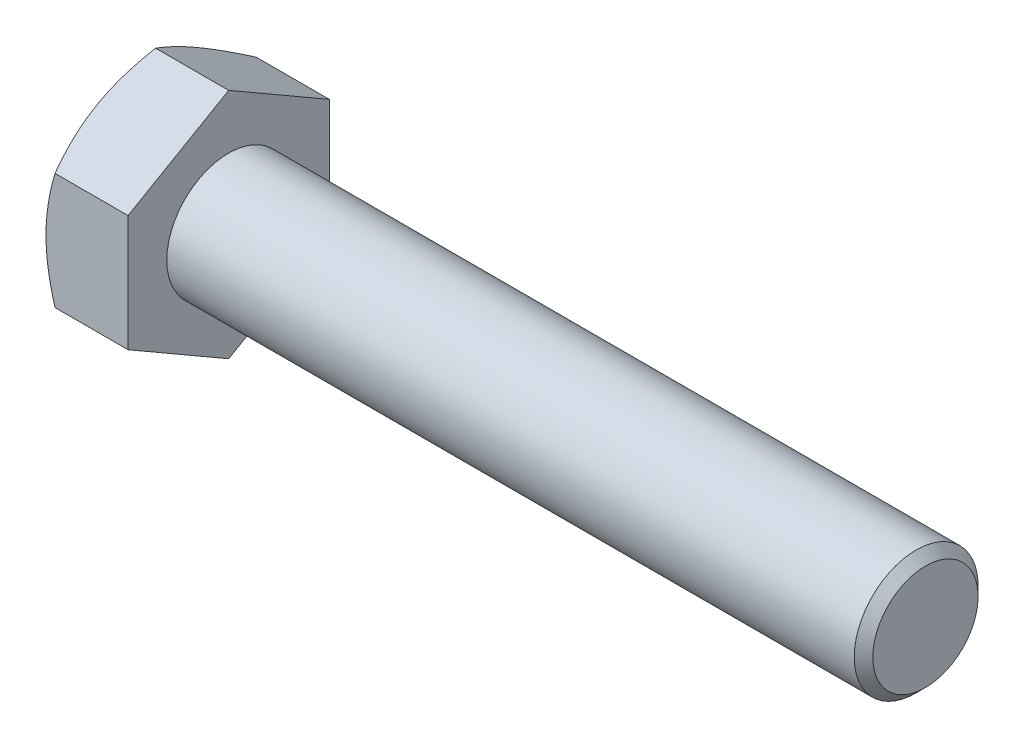
ISO-10303-21;
HEADER;
FILE_DESCRIPTION(('STEP AP214'),'2;1');
FILE_NAME('part.step','',(''),(''),'','','');
FILE_SCHEMA(('AUTOMOTIVE_DESIGN { 1 0 10303 214 1 1 1 1 }'));
ENDSEC;
DATA;
#1=APPLICATION_CONTEXT('core data for automotive mechanical design processes');
#2=APPLICATION_PROTOCOL_DEFINITION('international standard','automotive_design',2000,#1);
#3=PRODUCT_CONTEXT('',#1,'mechanical');
#4=PRODUCT('Part','Part','',(#3));
#5=PRODUCT_RELATED_PRODUCT_CATEGORY('part','',(#4));
#6=PRODUCT_DEFINITION_FORMATION('','',#4);
#7=PRODUCT_DEFINITION_CONTEXT('part definition',#1,'design');
#8=PRODUCT_DEFINITION('design','',#6,#7);
#9=PRODUCT_DEFINITION_SHAPE('','',#8);
#10=(LENGTH_UNIT() NAMED_UNIT(*) SI_UNIT(.MILLI.,.METRE.));
#11=(NAMED_UNIT(*) PLANE_ANGLE_UNIT() SI_UNIT($,.RADIAN.));
#12=(NAMED_UNIT(*) SI_UNIT($,.STERADIAN.) SOLID_ANGLE_UNIT());
#13=UNCERTAINTY_MEASURE_WITH_UNIT(LENGTH_MEASURE(1.E-05),#10,'distance_accuracy_value','');
#14=(GEOMETRIC_REPRESENTATION_CONTEXT(3) GLOBAL_UNCERTAINTY_ASSIGNED_CONTEXT((#13)) GLOBAL_UNIT_ASSIGNED_CONTEXT((#10,
#11,#12)) REPRESENTATION_CONTEXT('',''));
#15=CARTESIAN_POINT('',(0.,0.,0.));
#16=DIRECTION('',(0.,0.,1.));
#17=DIRECTION('',(1.,0.,0.));
#18=AXIS2_PLACEMENT_3D('',#15,#16,#17);
#19=CARTESIAN_POINT('',(-25.15,-3.75277674973257,-6.5));
#20=DIRECTION('',(-1.,0.,0.));
#21=DIRECTION('',(0.,0.,1.));
#22=AXIS2_PLACEMENT_3D('',#19,#20,#21);
#23=PLANE('',#22);
#24=CARTESIAN_POINT('',(-25.15,0.,0.));
#25=DIRECTION('',(-1.,0.,0.));
#26=DIRECTION('',(0.,0.,1.));
#27=AXIS2_PLACEMENT_3D('',#24,#25,#26);
#28=CIRCLE('',#27,6.5);
#29=CARTESIAN_POINT('',(-25.15,-5.62916512459885,3.25));
#30=VERTEX_POINT('',#29);
#31=CARTESIAN_POINT('',(-25.15,0.,6.5));
#32=VERTEX_POINT('',#31);
#33=EDGE_CURVE('E142',#30,#32,#28,.T.);
#34=ORIENTED_EDGE('',*,*,#33,.T.);
#35=CARTESIAN_POINT('',(-25.15,0.,0.));
#36=DIRECTION('',(-1.,0.,0.));
#37=DIRECTION('',(0.,0.,1.));
#38=AXIS2_PLACEMENT_3D('',#35,#36,#37);
#39=CIRCLE('',#38,6.5);
#40=CARTESIAN_POINT('',(-25.15,5.62916512459885,3.25));
#41=VERTEX_POINT('',#40);
#42=EDGE_CURVE('E11',#32,#41,#39,.T.);
#43=ORIENTED_EDGE('',*,*,#42,.T.);
#44=CARTESIAN_POINT('',(-25.15,0.,0.));
#45=DIRECTION('',(-1.,0.,0.));
#46=DIRECTION('',(0.,0.,1.));
#47=AXIS2_PLACEMENT_3D('',#44,#45,#46);
#48=CIRCLE('',#47,6.5);
#49=CARTESIAN_POINT('',(-25.15,5.62916512459885,-3.25));
#50=VERTEX_POINT('',#49);
#51=EDGE_CURVE('E28',#41,#50,#48,.T.);
#52=ORIENTED_EDGE('',*,*,#51,.T.);
#53=CARTESIAN_POINT('',(-25.15,0.,0.));
#54=DIRECTION('',(-1.,0.,0.));
#55=DIRECTION('',(0.,0.,1.));
#56=AXIS2_PLACEMENT_3D('',#53,#54,#55);
#57=CIRCLE('',#56,6.5);
#58=CARTESIAN_POINT('',(-25.15,0.,-6.5));
#59=VERTEX_POINT('',#58);
#60=EDGE_CURVE('E179',#50,#59,#57,.T.);
#61=ORIENTED_EDGE('',*,*,#60,.T.);
#62=CARTESIAN_POINT('',(-25.15,0.,0.));
#63=DIRECTION('',(-1.,0.,0.));
#64=DIRECTION('',(0.,0.,1.));
#65=AXIS2_PLACEMENT_3D('',#62,#63,#64);
#66=CIRCLE('',#65,6.5);
#67=CARTESIAN_POINT('',(-25.15,-5.62916512459885,-3.25));
#68=VERTEX_POINT('',#67);
#69=EDGE_CURVE('E141',#59,#68,#66,.T.);
#70=ORIENTED_EDGE('',*,*,#69,.T.);
#71=CARTESIAN_POINT('',(-25.15,0.,0.));
#72=DIRECTION('',(-1.,0.,0.));
#73=DIRECTION('',(0.,0.,1.));
#74=AXIS2_PLACEMENT_3D('',#71,#72,#73);
#75=CIRCLE('',#74,6.5);
#76=EDGE_CURVE('E136',#68,#30,#75,.T.);
#77=ORIENTED_EDGE('',*,*,#76,.T.);
#78=EDGE_LOOP('',(#34,#43,#52,#61,#70,#77));
#79=FACE_BOUND('',#78,.T.);
#80=ADVANCED_FACE('F17',(#79),#23,.T.);
#81=CARTESIAN_POINT('',(-25.15,0.,0.));
#82=DIRECTION('',(1.,0.,0.));
#83=DIRECTION('',(0.,0.,1.));
#84=AXIS2_PLACEMENT_3D('',#81,#82,#83);
#85=CONICAL_SURFACE('',#84,6.5,1.0471975511966);
#86=CARTESIAN_POINT('',(-25.15,0.,6.49999999999999));
#87=CARTESIAN_POINT('',(-25.15,1.74166975080559,6.49999999999999));
#88=CARTESIAN_POINT('',(-24.5694434163969,3.75277674974074,6.5));
#89=(BOUNDED_CURVE() B_SPLINE_CURVE(2,(#86,#87,#88),.UNSPECIFIED.,.F.,
.F.) B_SPLINE_CURVE_WITH_KNOTS((3,3),(1.73382513864546,2.42154946226623),
.UNSPECIFIED.) CURVE() GEOMETRIC_REPRESENTATION_ITEM() RATIONAL_B_SPLINE_CURVE((1.83937846828338,
1.83937846828338,1.70731703595936)) REPRESENTATION_ITEM(''));
#90=CARTESIAN_POINT('',(-24.5694434163992,3.75277674973257,6.5));
#91=VERTEX_POINT('',#90);
#92=EDGE_CURVE('E186',#32,#91,#89,.T.);
#93=ORIENTED_EDGE('',*,*,#92,.T.);
#94=CARTESIAN_POINT('',(-24.5694434163969,3.75277674972847,6.5000000000071));
#95=CARTESIAN_POINT('',(-25.15,4.75833024919605,4.75833024920056));
#96=CARTESIAN_POINT('',(-25.15,5.62916512459884,3.25000000000002));
#97=(BOUNDED_CURVE() B_SPLINE_CURVE(2,(#94,#95,#96),.UNSPECIFIED.,.F.,
.F.) B_SPLINE_CURVE_WITH_KNOTS((3,3),(1.04610081502468,1.73382513864545),
.UNSPECIFIED.) CURVE() GEOMETRIC_REPRESENTATION_ITEM() RATIONAL_B_SPLINE_CURVE((1.70731703595935,
1.83937846828338,1.83937846828338)) REPRESENTATION_ITEM(''));
#98=EDGE_CURVE('E180',#91,#41,#97,.T.);
#99=ORIENTED_EDGE('',*,*,#98,.T.);
#100=ORIENTED_EDGE('',*,*,#42,.F.);
#101=EDGE_LOOP('',(#93,#99,#100));
#102=FACE_BOUND('',#101,.T.);
#103=ADVANCED_FACE('F480',(#102),#85,.T.);
#104=CARTESIAN_POINT('',(-25.15,0.,0.));
#105=DIRECTION('',(1.,0.,0.));
#106=DIRECTION('',(0.,0.,1.));
#107=AXIS2_PLACEMENT_3D('',#104,#105,#106);
#108=CONICAL_SURFACE('',#107,6.5,1.0471975511966);
#109=CARTESIAN_POINT('',(-25.15,5.62916512459884,3.25000000000002));
#110=CARTESIAN_POINT('',(-25.15,6.50000000000165,1.74166975079946));
#111=CARTESIAN_POINT('',(-24.5694434163969,7.50555349946923,-7.07991775886938E-12));
#112=(BOUNDED_CURVE() B_SPLINE_CURVE(2,(#109,#110,#111),.UNSPECIFIED.,.F.,
.F.) B_SPLINE_CURVE_WITH_KNOTS((3,3),(1.73382513864545,2.42154946226623),
.UNSPECIFIED.) CURVE() GEOMETRIC_REPRESENTATION_ITEM() RATIONAL_B_SPLINE_CURVE((1.83937846828338,
1.83937846828338,1.70731703595936)) REPRESENTATION_ITEM(''));
#113=CARTESIAN_POINT('',(-24.5694434163992,7.50555349946513,0.));
#114=VERTEX_POINT('',#113);
#115=EDGE_CURVE('E117',#41,#114,#112,.T.);
#116=ORIENTED_EDGE('',*,*,#115,.T.);
#117=CARTESIAN_POINT('',(-24.5694434163969,7.50555349946923,7.09968607327013E-12));
#118=CARTESIAN_POINT('',(-25.15,6.50000000000165,-1.74166975079944));
#119=CARTESIAN_POINT('',(-25.15,5.62916512459884,-3.25));
#120=(BOUNDED_CURVE() B_SPLINE_CURVE(2,(#117,#118,#119),.UNSPECIFIED.,.F.,
.F.) B_SPLINE_CURVE_WITH_KNOTS((3,3),(1.04610081502468,1.73382513864546),
.UNSPECIFIED.) CURVE() GEOMETRIC_REPRESENTATION_ITEM() RATIONAL_B_SPLINE_CURVE((1.70731703595935,
1.83937846828338,1.83937846828338)) REPRESENTATION_ITEM(''));
#121=EDGE_CURVE('E123',#114,#50,#120,.T.);
#122=ORIENTED_EDGE('',*,*,#121,.T.);
#123=ORIENTED_EDGE('',*,*,#51,.F.);
#124=EDGE_LOOP('',(#116,#122,#123));
#125=FACE_BOUND('',#124,.T.);
#126=ADVANCED_FACE('F354',(#125),#108,.T.);
#127=CARTESIAN_POINT('',(-25.15,0.,0.));
#128=DIRECTION('',(1.,0.,0.));
#129=DIRECTION('',(0.,0.,1.));
#130=AXIS2_PLACEMENT_3D('',#127,#128,#129);
#131=CONICAL_SURFACE('',#130,6.5,1.0471975511966);
#132=CARTESIAN_POINT('',(-24.5694434163969,3.75277674974075,-6.5));
#133=CARTESIAN_POINT('',(-25.15,1.7416697508056,-6.49999999999999));
#134=CARTESIAN_POINT('',(-25.15,0.,-6.49999999999999));
#135=(BOUNDED_CURVE() B_SPLINE_CURVE(2,(#132,#133,#134),.UNSPECIFIED.,.F.,
.F.) B_SPLINE_CURVE_WITH_KNOTS((3,3),(1.04610081502468,1.73382513864545),
.UNSPECIFIED.) CURVE() GEOMETRIC_REPRESENTATION_ITEM() RATIONAL_B_SPLINE_CURVE((1.70731703595935,
1.83937846828338,1.83937846828338)) REPRESENTATION_ITEM(''));
#136=CARTESIAN_POINT('',(-24.5694434163992,3.75277674973256,-6.5));
#137=VERTEX_POINT('',#136);
#138=EDGE_CURVE('E208',#137,#59,#135,.T.);
#139=ORIENTED_EDGE('',*,*,#138,.T.);
#140=ORIENTED_EDGE('',*,*,#60,.F.);
#141=CARTESIAN_POINT('',(-25.15,5.62916512459884,-3.25));
#142=CARTESIAN_POINT('',(-25.15,4.75833024919605,-4.75833024920056));
#143=CARTESIAN_POINT('',(-24.5694434163969,3.75277674972847,-6.50000000000709));
#144=(BOUNDED_CURVE() B_SPLINE_CURVE(2,(#141,#142,#143),.UNSPECIFIED.,.F.,
.F.) B_SPLINE_CURVE_WITH_KNOTS((3,3),(1.73382513864546,2.42154946226623),
.UNSPECIFIED.) CURVE() GEOMETRIC_REPRESENTATION_ITEM() RATIONAL_B_SPLINE_CURVE((1.83937846828338,
1.83937846828338,1.70731703595935)) REPRESENTATION_ITEM(''));
#145=EDGE_CURVE('E209',#50,#137,#144,.T.);
#146=ORIENTED_EDGE('',*,*,#145,.T.);
#147=EDGE_LOOP('',(#139,#140,#146));
#148=FACE_BOUND('',#147,.T.);
#149=ADVANCED_FACE('F352',(#148),#131,.T.);
#150=CARTESIAN_POINT('',(-25.15,0.,0.));
#151=DIRECTION('',(1.,0.,0.));
#152=DIRECTION('',(0.,0.,1.));
#153=AXIS2_PLACEMENT_3D('',#150,#151,#152);
#154=CONICAL_SURFACE('',#153,6.5,1.0471975511966);
#155=CARTESIAN_POINT('',(-25.15,0.,-6.49999999999999));
#156=CARTESIAN_POINT('',(-25.15,-1.74166975080557,-6.49999999999999));
#157=CARTESIAN_POINT('',(-24.5694434163969,-3.75277674974074,-6.5));
#158=(BOUNDED_CURVE() B_SPLINE_CURVE(2,(#155,#156,#157),.UNSPECIFIED.,.F.,
.F.) B_SPLINE_CURVE_WITH_KNOTS((3,3),(1.73382513864545,2.42154946226623),
.UNSPECIFIED.) CURVE() GEOMETRIC_REPRESENTATION_ITEM() RATIONAL_B_SPLINE_CURVE((1.83937846828338,
1.83937846828338,1.70731703595936)) REPRESENTATION_ITEM(''));
#159=CARTESIAN_POINT('',(-24.5694434163992,-3.75277674973257,-6.5));
#160=VERTEX_POINT('',#159);
#161=EDGE_CURVE('E135',#59,#160,#158,.T.);
#162=ORIENTED_EDGE('',*,*,#161,.T.);
#163=CARTESIAN_POINT('',(-24.5694434163969,-3.75277674972847,-6.5000000000071));
#164=CARTESIAN_POINT('',(-25.15,-4.75833024919605,-4.75833024920056));
#165=CARTESIAN_POINT('',(-25.15,-5.62916512459884,-3.25000000000001));
#166=(BOUNDED_CURVE() B_SPLINE_CURVE(2,(#163,#164,#165),.UNSPECIFIED.,.F.,
.F.) B_SPLINE_CURVE_WITH_KNOTS((3,3),(1.04610081502468,1.73382513864546),
.UNSPECIFIED.) CURVE() GEOMETRIC_REPRESENTATION_ITEM() RATIONAL_B_SPLINE_CURVE((1.70731703595935,
1.83937846828338,1.83937846828338)) REPRESENTATION_ITEM(''));
#167=EDGE_CURVE('E125',#160,#68,#166,.T.);
#168=ORIENTED_EDGE('',*,*,#167,.T.);
#169=ORIENTED_EDGE('',*,*,#69,.F.);
#170=EDGE_LOOP('',(#162,#168,#169));
#171=FACE_BOUND('',#170,.T.);
#172=ADVANCED_FACE('F350',(#171),#154,.T.);
#173=CARTESIAN_POINT('',(-25.15,0.,0.));
#174=DIRECTION('',(1.,0.,0.));
#175=DIRECTION('',(0.,0.,1.));
#176=AXIS2_PLACEMENT_3D('',#173,#174,#175);
#177=CONICAL_SURFACE('',#176,6.5,1.0471975511966);
#178=CARTESIAN_POINT('',(-25.15,-5.62916512459884,-3.25000000000001));
#179=CARTESIAN_POINT('',(-25.15,-6.50000000000165,-1.74166975079944));
#180=CARTESIAN_POINT('',(-24.5694434163969,-7.50555349946925,7.1249166850711E-12));
#181=(BOUNDED_CURVE() B_SPLINE_CURVE(2,(#178,#179,#180),.UNSPECIFIED.,.F.,
.F.) B_SPLINE_CURVE_WITH_KNOTS((3,3),(1.73382513864546,2.42154946226624),
.UNSPECIFIED.) CURVE() GEOMETRIC_REPRESENTATION_ITEM() RATIONAL_B_SPLINE_CURVE((1.83937846828338,
1.83937846828338,1.70731703595935)) REPRESENTATION_ITEM(''));
#182=CARTESIAN_POINT('',(-24.5694434163992,-7.50555349946514,0.));
#183=VERTEX_POINT('',#182);
#184=EDGE_CURVE('E113',#68,#183,#181,.T.);
#185=ORIENTED_EDGE('',*,*,#184,.T.);
#186=CARTESIAN_POINT('',(-24.5694434163969,-7.50555349946923,-7.09448388526992E-12));
#187=CARTESIAN_POINT('',(-25.15,-6.50000000000165,1.74166975079945));
#188=CARTESIAN_POINT('',(-25.15,-5.62916512459884,3.25));
#189=(BOUNDED_CURVE() B_SPLINE_CURVE(2,(#186,#187,#188),.UNSPECIFIED.,.F.,
.F.) B_SPLINE_CURVE_WITH_KNOTS((3,3),(1.04610081502468,1.73382513864546),
.UNSPECIFIED.) CURVE() GEOMETRIC_REPRESENTATION_ITEM() RATIONAL_B_SPLINE_CURVE((1.70731703595935,
1.83937846828338,1.83937846828338)) REPRESENTATION_ITEM(''));
#190=EDGE_CURVE('E237',#183,#30,#189,.T.);
#191=ORIENTED_EDGE('',*,*,#190,.T.);
#192=ORIENTED_EDGE('',*,*,#76,.F.);
#193=EDGE_LOOP('',(#185,#191,#192));
#194=FACE_BOUND('',#193,.T.);
#195=ADVANCED_FACE('F331',(#194),#177,.T.);
#196=CARTESIAN_POINT('',(-25.15,0.,0.));
#197=DIRECTION('',(1.,0.,0.));
#198=DIRECTION('',(0.,0.,1.));
#199=AXIS2_PLACEMENT_3D('',#196,#197,#198);
#200=CONICAL_SURFACE('',#199,6.5,1.0471975511966);
#201=CARTESIAN_POINT('',(-25.15,-5.62916512459884,3.25));
#202=CARTESIAN_POINT('',(-25.15,-4.75833024919609,4.75833024920049));
#203=CARTESIAN_POINT('',(-24.5694434163969,-3.75277674972857,6.50000000000693));
#204=(BOUNDED_CURVE() B_SPLINE_CURVE(2,(#201,#202,#203),.UNSPECIFIED.,.F.,
.F.) B_SPLINE_CURVE_WITH_KNOTS((3,3),(1.73382513864546,2.4215494622662),
.UNSPECIFIED.) CURVE() GEOMETRIC_REPRESENTATION_ITEM() RATIONAL_B_SPLINE_CURVE((1.83937846828338,
1.83937846828338,1.70731703595937)) REPRESENTATION_ITEM(''));
#205=CARTESIAN_POINT('',(-24.5694434163994,-3.75277674973285,6.5));
#206=VERTEX_POINT('',#205);
#207=EDGE_CURVE('E166',#30,#206,#204,.T.);
#208=ORIENTED_EDGE('',*,*,#207,.T.);
#209=CARTESIAN_POINT('',(-24.5694434163968,-3.75277674974098,6.49999999999999));
#210=CARTESIAN_POINT('',(-25.15,-1.74166975080567,6.49999999999999));
#211=CARTESIAN_POINT('',(-25.15,0.,6.49999999999999));
#212=(BOUNDED_CURVE() B_SPLINE_CURVE(2,(#209,#210,#211),.UNSPECIFIED.,.F.,
.F.) B_SPLINE_CURVE_WITH_KNOTS((3,3),(1.04610081502465,1.73382513864546),
.UNSPECIFIED.) CURVE() GEOMETRIC_REPRESENTATION_ITEM() RATIONAL_B_SPLINE_CURVE((1.70731703595934,
1.83937846828338,1.83937846828338)) REPRESENTATION_ITEM(''));
#213=EDGE_CURVE('E172',#206,#32,#212,.T.);
#214=ORIENTED_EDGE('',*,*,#213,.T.);
#215=ORIENTED_EDGE('',*,*,#33,.F.);
#216=EDGE_LOOP('',(#208,#214,#215));
#217=FACE_BOUND('',#216,.T.);
#218=ADVANCED_FACE('F19',(#217),#200,.T.);
#219=CARTESIAN_POINT('',(-25.15,7.50555349946513,0.));
#220=DIRECTION('',(0.,-0.866025403784439,0.5));
#221=DIRECTION('',(-1.,0.,0.));
#222=AXIS2_PLACEMENT_3D('',#219,#220,#221);
#223=PLANE('',#222);
#224=ORIENTED_EDGE('',*,*,#121,.F.);
#225=DIRECTION('',(1.,0.,0.));
#226=VECTOR('',#225,1.);
#227=CARTESIAN_POINT('',(-25.15,7.50555349946513,0.));
#228=LINE('',#227,#226);
#229=CARTESIAN_POINT('',(-19.85,7.50555349946513,0.));
#230=VERTEX_POINT('',#229);
#231=EDGE_CURVE('E124',#114,#230,#228,.T.);
#232=ORIENTED_EDGE('',*,*,#231,.T.);
#233=DIRECTION('',(0.,-0.5,-0.866025403784439));
#234=VECTOR('',#233,1.);
#235=CARTESIAN_POINT('',(-19.85,7.50555349946513,0.));
#236=LINE('',#235,#234);
#237=CARTESIAN_POINT('',(-19.85,3.75277674973256,-6.5));
#238=VERTEX_POINT('',#237);
#239=EDGE_CURVE('E194',#230,#238,#236,.T.);
#240=ORIENTED_EDGE('',*,*,#239,.T.);
#241=DIRECTION('',(1.,0.,0.));
#242=VECTOR('',#241,1.);
#243=CARTESIAN_POINT('',(-25.15,3.75277674973256,-6.5));
#244=LINE('',#243,#242);
#245=EDGE_CURVE('E201',#137,#238,#244,.T.);
#246=ORIENTED_EDGE('',*,*,#245,.F.);
#247=ORIENTED_EDGE('',*,*,#145,.F.);
#248=EDGE_LOOP('',(#224,#232,#240,#246,#247));
#249=FACE_BOUND('',#248,.T.);
#250=ADVANCED_FACE('F286',(#249),#223,.F.);
#251=CARTESIAN_POINT('',(-25.15,3.75277674973257,6.5));
#252=DIRECTION('',(0.,-0.866025403784439,-0.5));
#253=DIRECTION('',(0.,0.5,-0.866025403784439));
#254=AXIS2_PLACEMENT_3D('',#251,#252,#253);
#255=PLANE('',#254);
#256=ORIENTED_EDGE('',*,*,#98,.F.);
#257=DIRECTION('',(1.,0.,0.));
#258=VECTOR('',#257,1.);
#259=CARTESIAN_POINT('',(-25.15,3.75277674973257,6.5));
#260=LINE('',#259,#258);
#261=CARTESIAN_POINT('',(-19.85,3.75277674973257,6.5));
#262=VERTEX_POINT('',#261);
#263=EDGE_CURVE('E21',#91,#262,#260,.T.);
#264=ORIENTED_EDGE('',*,*,#263,.T.);
#265=DIRECTION('',(0.,0.5,-0.866025403784439));
#266=VECTOR('',#265,1.);
#267=CARTESIAN_POINT('',(-19.85,3.75277674973257,6.5));
#268=LINE('',#267,#266);
#269=EDGE_CURVE('E165',#262,#230,#268,.T.);
#270=ORIENTED_EDGE('',*,*,#269,.T.);
#271=ORIENTED_EDGE('',*,*,#231,.F.);
#272=ORIENTED_EDGE('',*,*,#115,.F.);
#273=EDGE_LOOP('',(#256,#264,#270,#271,#272));
#274=FACE_BOUND('',#273,.T.);
#275=ADVANCED_FACE('F357',(#274),#255,.F.);
#276=CARTESIAN_POINT('',(-25.15,-3.75277674973257,6.5));
#277=DIRECTION('',(0.,0.,-1.));
#278=DIRECTION('',(0.,-1.,0.));
#279=AXIS2_PLACEMENT_3D('',#276,#277,#278);
#280=PLANE('',#279);
#281=ORIENTED_EDGE('',*,*,#213,.F.);
#282=DIRECTION('',(1.,0.,0.));
#283=VECTOR('',#282,1.);
#284=CARTESIAN_POINT('',(-25.15,-3.75277674973257,6.5));
#285=LINE('',#284,#283);
#286=CARTESIAN_POINT('',(-19.85,-3.75277674973257,6.5));
#287=VERTEX_POINT('',#286);
#288=EDGE_CURVE('E173',#206,#287,#285,.T.);
#289=ORIENTED_EDGE('',*,*,#288,.T.);
#290=DIRECTION('',(0.,1.,0.));
#291=VECTOR('',#290,1.);
#292=CARTESIAN_POINT('',(-19.85,-3.75277674973257,6.5));
#293=LINE('',#292,#291);
#294=EDGE_CURVE('E149',#287,#262,#293,.T.);
#295=ORIENTED_EDGE('',*,*,#294,.T.);
#296=ORIENTED_EDGE('',*,*,#263,.F.);
#297=ORIENTED_EDGE('',*,*,#92,.F.);
#298=EDGE_LOOP('',(#281,#289,#295,#296,#297));
#299=FACE_BOUND('',#298,.T.);
#300=ADVANCED_FACE('F336',(#299),#280,.F.);
#301=CARTESIAN_POINT('',(-25.15,-7.50555349946514,0.));
#302=DIRECTION('',(0.,0.866025403784439,-0.5));
#303=DIRECTION('',(-1.,0.,0.));
#304=AXIS2_PLACEMENT_3D('',#301,#302,#303);
#305=PLANE('',#304);
#306=ORIENTED_EDGE('',*,*,#190,.F.);
#307=DIRECTION('',(1.,0.,0.));
#308=VECTOR('',#307,1.);
#309=CARTESIAN_POINT('',(-25.15,-7.50555349946514,0.));
#310=LINE('',#309,#308);
#311=CARTESIAN_POINT('',(-19.85,-7.50555349946514,0.));
#312=VERTEX_POINT('',#311);
#313=EDGE_CURVE('E134',#183,#312,#310,.T.);
#314=ORIENTED_EDGE('',*,*,#313,.T.);
#315=DIRECTION('',(0.,0.5,0.866025403784439));
#316=VECTOR('',#315,1.);
#317=CARTESIAN_POINT('',(-19.85,-7.50555349946514,0.));
#318=LINE('',#317,#316);
#319=EDGE_CURVE('E144',#312,#287,#318,.T.);
#320=ORIENTED_EDGE('',*,*,#319,.T.);
#321=ORIENTED_EDGE('',*,*,#288,.F.);
#322=ORIENTED_EDGE('',*,*,#207,.F.);
#323=EDGE_LOOP('',(#306,#314,#320,#321,#322));
#324=FACE_BOUND('',#323,.T.);
#325=ADVANCED_FACE('F325',(#324),#305,.F.);
#326=CARTESIAN_POINT('',(-25.15,-3.75277674973257,-6.5));
#327=DIRECTION('',(0.,0.866025403784439,0.5));
#328=DIRECTION('',(1.,0.,0.));
#329=AXIS2_PLACEMENT_3D('',#326,#327,#328);
#330=PLANE('',#329);
#331=ORIENTED_EDGE('',*,*,#167,.F.);
#332=DIRECTION('',(1.,0.,0.));
#333=VECTOR('',#332,1.);
#334=CARTESIAN_POINT('',(-25.15,-3.75277674973257,-6.5));
#335=LINE('',#334,#333);
#336=CARTESIAN_POINT('',(-19.85,-3.75277674973257,-6.5));
#337=VERTEX_POINT('',#336);
#338=EDGE_CURVE('E158',#160,#337,#335,.T.);
#339=ORIENTED_EDGE('',*,*,#338,.T.);
#340=DIRECTION('',(0.,-0.5,0.866025403784439));
#341=VECTOR('',#340,1.);
#342=CARTESIAN_POINT('',(-19.85,-3.75277674973257,-6.5));
#343=LINE('',#342,#341);
#344=EDGE_CURVE('E148',#337,#312,#343,.T.);
#345=ORIENTED_EDGE('',*,*,#344,.T.);
#346=ORIENTED_EDGE('',*,*,#313,.F.);
#347=ORIENTED_EDGE('',*,*,#184,.F.);
#348=EDGE_LOOP('',(#331,#339,#345,#346,#347));
#349=FACE_BOUND('',#348,.T.);
#350=ADVANCED_FACE('F333',(#349),#330,.F.);
#351=CARTESIAN_POINT('',(-25.15,3.75277674973256,-6.5));
#352=DIRECTION('',(0.,0.,1.));
#353=DIRECTION('',(0.,-1.,0.));
#354=AXIS2_PLACEMENT_3D('',#351,#352,#353);
#355=PLANE('',#354);
#356=ORIENTED_EDGE('',*,*,#138,.F.);
#357=ORIENTED_EDGE('',*,*,#245,.T.);
#358=DIRECTION('',(0.,-1.,0.));
#359=VECTOR('',#358,1.);
#360=CARTESIAN_POINT('',(-19.85,3.75277674973256,-6.5));
#361=LINE('',#360,#359);
#362=EDGE_CURVE('E187',#238,#337,#361,.T.);
#363=ORIENTED_EDGE('',*,*,#362,.T.);
#364=ORIENTED_EDGE('',*,*,#338,.F.);
#365=ORIENTED_EDGE('',*,*,#161,.F.);
#366=EDGE_LOOP('',(#356,#357,#363,#364,#365));
#367=FACE_BOUND('',#366,.T.);
#368=ADVANCED_FACE('F301',(#367),#355,.F.);
#369=CARTESIAN_POINT('',(-19.85,-3.75277674973257,-6.5));
#370=DIRECTION('',(-1.,0.,0.));
#371=DIRECTION('',(0.,0.,1.));
#372=AXIS2_PLACEMENT_3D('',#369,#370,#371);
#373=PLANE('',#372);
#374=CARTESIAN_POINT('',(-19.85,0.,0.));
#375=DIRECTION('',(1.,0.,0.));
#376=DIRECTION('',(0.,0.,-1.));
#377=AXIS2_PLACEMENT_3D('',#374,#375,#376);
#378=CIRCLE('',#377,4.);
#379=CARTESIAN_POINT('',(-19.85,0.,4.));
#380=VERTEX_POINT('',#379);
#381=EDGE_CURVE('E195',#380,#380,#378,.T.);
#382=ORIENTED_EDGE('',*,*,#381,.F.);
#383=EDGE_LOOP('',(#382));
#384=FACE_BOUND('',#383,.T.);
#385=ORIENTED_EDGE('',*,*,#362,.F.);
#386=ORIENTED_EDGE('',*,*,#239,.F.);
#387=ORIENTED_EDGE('',*,*,#269,.F.);
#388=ORIENTED_EDGE('',*,*,#294,.F.);
#389=ORIENTED_EDGE('',*,*,#319,.F.);
#390=ORIENTED_EDGE('',*,*,#344,.F.);
#391=EDGE_LOOP('',(#385,#386,#387,#388,#389,#390));
#392=FACE_BOUND('',#391,.T.);
#393=ADVANCED_FACE('F297',(#384,#392),#373,.F.);
#394=CARTESIAN_POINT('',(25.15,0.,0.));
#395=DIRECTION('',(1.,0.,0.));
#396=DIRECTION('',(0.,1.,0.));
#397=AXIS2_PLACEMENT_3D('',#394,#395,#396);
#398=PLANE('',#397);
#399=CARTESIAN_POINT('',(25.15,0.,0.));
#400=DIRECTION('',(-1.,0.,0.));
#401=DIRECTION('',(0.,0.,-1.));
#402=AXIS2_PLACEMENT_3D('',#399,#400,#401);
#403=CIRCLE('',#402,3.4);
#404=CARTESIAN_POINT('',(25.15,0.,3.4));
#405=VERTEX_POINT('',#404);
#406=EDGE_CURVE('E100',#405,#405,#403,.T.);
#407=ORIENTED_EDGE('',*,*,#406,.F.);
#408=EDGE_LOOP('',(#407));
#409=FACE_BOUND('',#408,.T.);
#410=ADVANCED_FACE('F498',(#409),#398,.T.);
#411=CARTESIAN_POINT('',(-19.85,0.,0.));
#412=DIRECTION('',(1.,0.,0.));
#413=DIRECTION('',(0.,0.,-1.));
#414=AXIS2_PLACEMENT_3D('',#411,#412,#413);
#415=CYLINDRICAL_SURFACE('',#414,4.);
#416=CARTESIAN_POINT('',(24.55,0.,0.));
#417=DIRECTION('',(1.,0.,0.));
#418=DIRECTION('',(0.,0.,-1.));
#419=AXIS2_PLACEMENT_3D('',#416,#417,#418);
#420=CIRCLE('',#419,4.);
#421=CARTESIAN_POINT('',(24.55,0.,4.));
#422=VERTEX_POINT('',#421);
#423=EDGE_CURVE('E101',#422,#422,#420,.T.);
#424=ORIENTED_EDGE('',*,*,#423,.F.);
#425=DIRECTION('',(-1.,0.,0.));
#426=VECTOR('',#425,1.);
#427=CARTESIAN_POINT('',(-19.85,0.,4.));
#428=LINE('',#427,#426);
#429=EDGE_CURVE('E86',#422,#380,#428,.T.);
#430=ORIENTED_EDGE('',*,*,#429,.T.);
#431=ORIENTED_EDGE('',*,*,#381,.T.);
#432=ORIENTED_EDGE('',*,*,#429,.F.);
#433=EDGE_LOOP('',(#424,#430,#431,#432));
#434=FACE_BOUND('',#433,.T.);
#435=ADVANCED_FACE('F521',(#434),#415,.T.);
#436=CARTESIAN_POINT('',(24.85,0.,0.));
#437=DIRECTION('',(-1.,0.,0.));
#438=DIRECTION('',(0.,0.,-1.));
#439=AXIS2_PLACEMENT_3D('',#436,#437,#438);
#440=CONICAL_SURFACE('',#439,3.7,0.785398163397444);
#441=ORIENTED_EDGE('',*,*,#406,.T.);
#442=DIRECTION('',(-0.70710678118655,0.,0.707106781186545));
#443=VECTOR('',#442,1.);
#444=CARTESIAN_POINT('',(24.85,0.,3.7));
#445=LINE('',#444,#443);
#446=EDGE_CURVE('E97',#405,#422,#445,.T.);
#447=ORIENTED_EDGE('',*,*,#446,.T.);
#448=ORIENTED_EDGE('',*,*,#423,.T.);
#449=ORIENTED_EDGE('',*,*,#446,.F.);
#450=EDGE_LOOP('',(#441,#447,#448,#449));
#451=FACE_BOUND('',#450,.T.);
#452=ADVANCED_FACE('F98',(#451),#440,.T.);
#453=CLOSED_SHELL('',(#80,#103,#126,#149,#172,#195,#218,#250,#275,#300,#325,#350,#368,#393,#410,
#435,#452));
#454=MANIFOLD_SOLID_BREP('B1',#453);
#455=ADVANCED_BREP_SHAPE_REPRESENTATION('',(#18,#454),#14);
#456=SHAPE_DEFINITION_REPRESENTATION(#9,#455);
ENDSEC;
END-ISO-10303-21;
